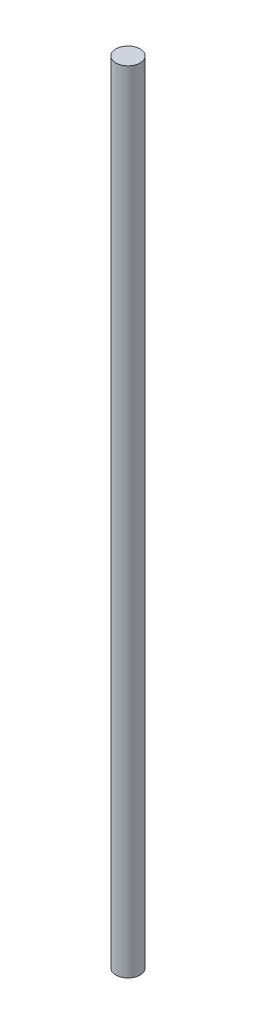
ISO-10303-21;
HEADER;
FILE_DESCRIPTION(('STEP AP214'),'2;1');
FILE_NAME('part.step','',(''),(''),'','','');
FILE_SCHEMA(('AUTOMOTIVE_DESIGN { 1 0 10303 214 1 1 1 1 }'));
ENDSEC;
DATA;
#1=APPLICATION_CONTEXT('core data for automotive mechanical design processes');
#2=APPLICATION_PROTOCOL_DEFINITION('international standard','automotive_design',2000,#1);
#3=PRODUCT_CONTEXT('',#1,'mechanical');
#4=PRODUCT('Part','Part','',(#3));
#5=PRODUCT_RELATED_PRODUCT_CATEGORY('part','',(#4));
#6=PRODUCT_DEFINITION_FORMATION('','',#4);
#7=PRODUCT_DEFINITION_CONTEXT('part definition',#1,'design');
#8=PRODUCT_DEFINITION('design','',#6,#7);
#9=PRODUCT_DEFINITION_SHAPE('','',#8);
#10=(LENGTH_UNIT() NAMED_UNIT(*) SI_UNIT(.MILLI.,.METRE.));
#11=(NAMED_UNIT(*) PLANE_ANGLE_UNIT() SI_UNIT($,.RADIAN.));
#12=(NAMED_UNIT(*) SI_UNIT($,.STERADIAN.) SOLID_ANGLE_UNIT());
#13=UNCERTAINTY_MEASURE_WITH_UNIT(LENGTH_MEASURE(1.E-05),#10,'distance_accuracy_value','');
#14=(GEOMETRIC_REPRESENTATION_CONTEXT(3) GLOBAL_UNCERTAINTY_ASSIGNED_CONTEXT((#13)) GLOBAL_UNIT_ASSIGNED_CONTEXT((#10,
#11,#12)) REPRESENTATION_CONTEXT('',''));
#15=CARTESIAN_POINT('',(0.,0.,0.));
#16=DIRECTION('',(0.,0.,1.));
#17=DIRECTION('',(1.,0.,0.));
#18=AXIS2_PLACEMENT_3D('',#15,#16,#17);
#19=CARTESIAN_POINT('',(0.,1300.,0.));
#20=DIRECTION('',(0.,-1.,0.));
#21=DIRECTION('',(0.,0.,-1.));
#22=AXIS2_PLACEMENT_3D('',#19,#20,#21);
#23=CYLINDRICAL_SURFACE('',#22,20.);
#24=CARTESIAN_POINT('',(0.,1300.,0.));
#25=DIRECTION('',(0.,1.,0.));
#26=DIRECTION('',(0.,0.,1.));
#27=AXIS2_PLACEMENT_3D('',#24,#25,#26);
#28=CIRCLE('',#27,20.);
#29=CARTESIAN_POINT('',(0.,1300.,20.));
#30=VERTEX_POINT('',#29);
#31=EDGE_CURVE('E10',#30,#30,#28,.T.);
#32=ORIENTED_EDGE('',*,*,#31,.F.);
#33=EDGE_LOOP('',(#32));
#34=FACE_BOUND('',#33,.T.);
#35=CARTESIAN_POINT('',(0.,0.,0.));
#36=DIRECTION('',(0.,1.,0.));
#37=DIRECTION('',(0.,0.,1.));
#38=AXIS2_PLACEMENT_3D('',#35,#36,#37);
#39=CIRCLE('',#38,20.);
#40=CARTESIAN_POINT('',(0.,0.,20.));
#41=VERTEX_POINT('',#40);
#42=EDGE_CURVE('E33',#41,#41,#39,.T.);
#43=ORIENTED_EDGE('',*,*,#42,.T.);
#44=EDGE_LOOP('',(#43));
#45=FACE_BOUND('',#44,.T.);
#46=ADVANCED_FACE('F30',(#34,#45),#23,.T.);
#47=CARTESIAN_POINT('',(0.,1300.,0.));
#48=DIRECTION('',(0.,1.,0.));
#49=DIRECTION('',(0.,0.,1.));
#50=AXIS2_PLACEMENT_3D('',#47,#48,#49);
#51=PLANE('',#50);
#52=ORIENTED_EDGE('',*,*,#31,.T.);
#53=EDGE_LOOP('',(#52));
#54=FACE_BOUND('',#53,.T.);
#55=ADVANCED_FACE('F45',(#54),#51,.T.);
#56=CARTESIAN_POINT('',(0.,0.,0.));
#57=DIRECTION('',(0.,1.,0.));
#58=DIRECTION('',(0.,0.,1.));
#59=AXIS2_PLACEMENT_3D('',#56,#57,#58);
#60=PLANE('',#59);
#61=ORIENTED_EDGE('',*,*,#42,.F.);
#62=EDGE_LOOP('',(#61));
#63=FACE_BOUND('',#62,.T.);
#64=ADVANCED_FACE('F43',(#63),#60,.F.);
#65=CLOSED_SHELL('',(#46,#55,#64));
#66=MANIFOLD_SOLID_BREP('B2',#65);
#67=ADVANCED_BREP_SHAPE_REPRESENTATION('',(#18,#66),#14);
#68=SHAPE_DEFINITION_REPRESENTATION(#9,#67);
ENDSEC;
END-ISO-10303-21;
